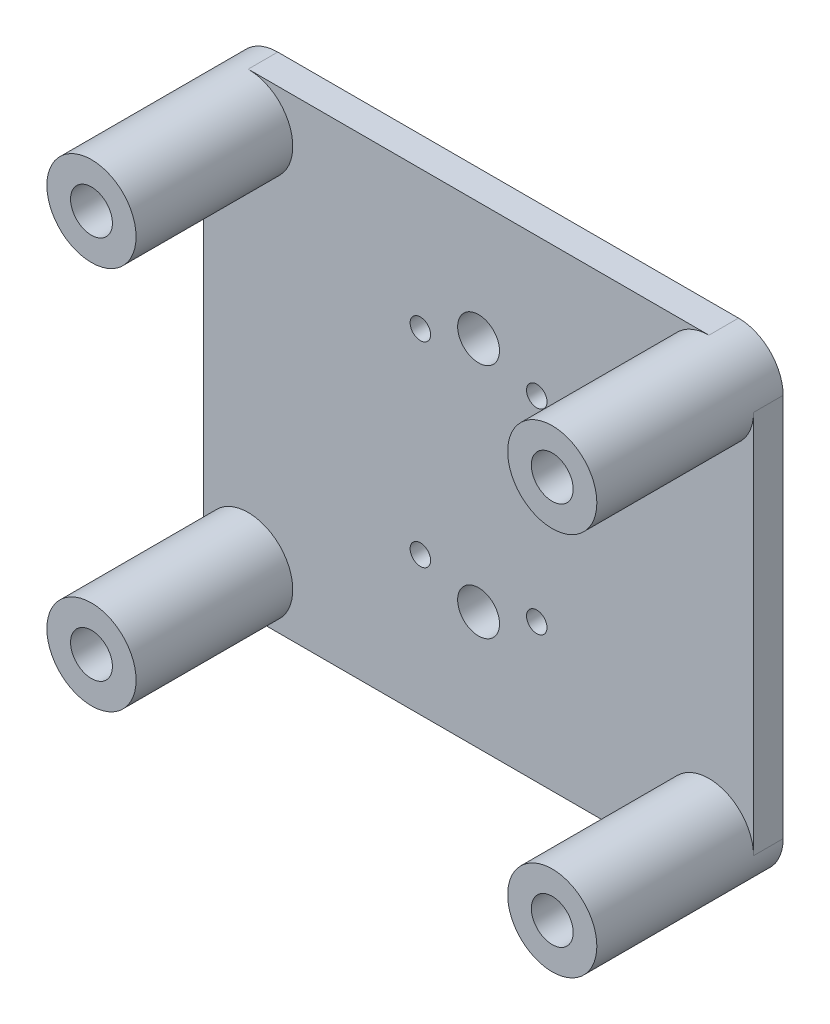
ISO-10303-21;
HEADER;
FILE_DESCRIPTION(('STEP AP214'),'2;1');
FILE_NAME('part.step','',(''),(''),'','','');
FILE_SCHEMA(('AUTOMOTIVE_DESIGN { 1 0 10303 214 1 1 1 1 }'));
ENDSEC;
DATA;
#1=APPLICATION_CONTEXT('core data for automotive mechanical design processes');
#2=APPLICATION_PROTOCOL_DEFINITION('international standard','automotive_design',2000,#1);
#3=PRODUCT_CONTEXT('',#1,'mechanical');
#4=PRODUCT('Part','Part','',(#3));
#5=PRODUCT_RELATED_PRODUCT_CATEGORY('part','',(#4));
#6=PRODUCT_DEFINITION_FORMATION('','',#4);
#7=PRODUCT_DEFINITION_CONTEXT('part definition',#1,'design');
#8=PRODUCT_DEFINITION('design','',#6,#7);
#9=PRODUCT_DEFINITION_SHAPE('','',#8);
#10=(LENGTH_UNIT() NAMED_UNIT(*) SI_UNIT(.MILLI.,.METRE.));
#11=(NAMED_UNIT(*) PLANE_ANGLE_UNIT() SI_UNIT($,.RADIAN.));
#12=(NAMED_UNIT(*) SI_UNIT($,.STERADIAN.) SOLID_ANGLE_UNIT());
#13=UNCERTAINTY_MEASURE_WITH_UNIT(LENGTH_MEASURE(1.E-05),#10,'distance_accuracy_value','');
#14=(GEOMETRIC_REPRESENTATION_CONTEXT(3) GLOBAL_UNCERTAINTY_ASSIGNED_CONTEXT((#13)) GLOBAL_UNIT_ASSIGNED_CONTEXT((#10,
#11,#12)) REPRESENTATION_CONTEXT('',''));
#15=CARTESIAN_POINT('',(0.,0.,0.));
#16=DIRECTION('',(0.,0.,1.));
#17=DIRECTION('',(1.,0.,0.));
#18=AXIS2_PLACEMENT_3D('',#15,#16,#17);
#19=CARTESIAN_POINT('',(0.,0.,3.175));
#20=DIRECTION('',(0.,0.,1.));
#21=DIRECTION('',(1.,0.,0.));
#22=AXIS2_PLACEMENT_3D('',#19,#20,#21);
#23=PLANE('',#22);
#24=CARTESIAN_POINT('',(19.1649466018959,37.6213878639813,3.175));
#25=DIRECTION('',(0.,0.,1.));
#26=DIRECTION('',(1.,0.,0.));
#27=AXIS2_PLACEMENT_3D('',#24,#25,#26);
#28=CIRCLE('',#27,1.1);
#29=CARTESIAN_POINT('',(20.2649466018959,37.6213878639813,3.175));
#30=VERTEX_POINT('',#29);
#31=EDGE_CURVE('E127',#30,#30,#28,.T.);
#32=ORIENTED_EDGE('',*,*,#31,.F.);
#33=EDGE_LOOP('',(#32));
#34=FACE_BOUND('',#33,.T.);
#35=CARTESIAN_POINT('',(6.66494660189593,37.6213878639814,3.175));
#36=DIRECTION('',(0.,0.,1.));
#37=DIRECTION('',(1.,0.,0.));
#38=AXIS2_PLACEMENT_3D('',#35,#36,#37);
#39=CIRCLE('',#38,1.1);
#40=CARTESIAN_POINT('',(7.76494660189593,37.6213878639814,3.175));
#41=VERTEX_POINT('',#40);
#42=EDGE_CURVE('E207',#41,#41,#39,.T.);
#43=ORIENTED_EDGE('',*,*,#42,.F.);
#44=EDGE_LOOP('',(#43));
#45=FACE_BOUND('',#44,.T.);
#46=CARTESIAN_POINT('',(6.66494660189591,16.6213878639814,3.175));
#47=DIRECTION('',(0.,0.,1.));
#48=DIRECTION('',(1.,0.,0.));
#49=AXIS2_PLACEMENT_3D('',#46,#47,#48);
#50=CIRCLE('',#49,1.1);
#51=CARTESIAN_POINT('',(7.76494660189591,16.6213878639814,3.175));
#52=VERTEX_POINT('',#51);
#53=EDGE_CURVE('E204',#52,#52,#50,.T.);
#54=ORIENTED_EDGE('',*,*,#53,.F.);
#55=EDGE_LOOP('',(#54));
#56=FACE_BOUND('',#55,.T.);
#57=CARTESIAN_POINT('',(19.1649466018959,16.6213878639813,3.175));
#58=DIRECTION('',(0.,0.,1.));
#59=DIRECTION('',(1.,0.,0.));
#60=AXIS2_PLACEMENT_3D('',#57,#58,#59);
#61=CIRCLE('',#60,1.1);
#62=CARTESIAN_POINT('',(20.2649466018959,16.6213878639813,3.175));
#63=VERTEX_POINT('',#62);
#64=EDGE_CURVE('E201',#63,#63,#61,.T.);
#65=ORIENTED_EDGE('',*,*,#64,.F.);
#66=EDGE_LOOP('',(#65));
#67=FACE_BOUND('',#66,.T.);
#68=CARTESIAN_POINT('',(12.9149466018959,14.4213878639813,3.175));
#69=DIRECTION('',(0.,0.,1.));
#70=DIRECTION('',(1.,0.,0.));
#71=AXIS2_PLACEMENT_3D('',#68,#69,#70);
#72=CIRCLE('',#71,2.2479);
#73=CARTESIAN_POINT('',(15.1628466018959,14.4213878639813,3.175));
#74=VERTEX_POINT('',#73);
#75=EDGE_CURVE('E198',#74,#74,#72,.T.);
#76=ORIENTED_EDGE('',*,*,#75,.F.);
#77=EDGE_LOOP('',(#76));
#78=FACE_BOUND('',#77,.T.);
#79=CARTESIAN_POINT('',(12.9149466018959,39.8213878639813,3.175));
#80=DIRECTION('',(0.,0.,1.));
#81=DIRECTION('',(1.,0.,0.));
#82=AXIS2_PLACEMENT_3D('',#79,#80,#81);
#83=CIRCLE('',#82,2.2479);
#84=CARTESIAN_POINT('',(15.1628466018959,39.8213878639813,3.175));
#85=VERTEX_POINT('',#84);
#86=EDGE_CURVE('E119',#85,#85,#83,.T.);
#87=ORIENTED_EDGE('',*,*,#86,.F.);
#88=EDGE_LOOP('',(#87));
#89=FACE_BOUND('',#88,.T.);
#90=DIRECTION('',(1.,0.,0.));
#91=VECTOR('',#90,1.);
#92=CARTESIAN_POINT('',(0.,1.72138786398134,3.175));
#93=LINE('',#92,#91);
#94=CARTESIAN_POINT('',(-11.8246533981041,1.72138786398134,3.175));
#95=VERTEX_POINT('',#94);
#96=CARTESIAN_POINT('',(37.6545466018959,1.72138786398134,3.175));
#97=VERTEX_POINT('',#96);
#98=EDGE_CURVE('E115',#95,#97,#93,.T.);
#99=ORIENTED_EDGE('',*,*,#98,.T.);
#100=CARTESIAN_POINT('',(37.6545466018959,6.50928786398134,3.175));
#101=DIRECTION('',(0.,0.,1.));
#102=DIRECTION('',(1.,0.,0.));
#103=AXIS2_PLACEMENT_3D('',#100,#101,#102);
#104=CIRCLE('',#103,4.7879);
#105=CARTESIAN_POINT('',(42.4424466018959,6.50928786398134,3.175));
#106=VERTEX_POINT('',#105);
#107=EDGE_CURVE('E52',#97,#106,#104,.F.);
#108=ORIENTED_EDGE('',*,*,#107,.T.);
#109=DIRECTION('',(0.,1.,0.));
#110=VECTOR('',#109,1.);
#111=CARTESIAN_POINT('',(42.4424466018959,0.,3.175));
#112=LINE('',#111,#110);
#113=CARTESIAN_POINT('',(42.4424466018959,47.7334878639813,3.175));
#114=VERTEX_POINT('',#113);
#115=EDGE_CURVE('E94',#106,#114,#112,.T.);
#116=ORIENTED_EDGE('',*,*,#115,.T.);
#117=CARTESIAN_POINT('',(37.6545466018959,47.7334878639813,3.175));
#118=DIRECTION('',(0.,0.,1.));
#119=DIRECTION('',(1.,0.,0.));
#120=AXIS2_PLACEMENT_3D('',#117,#118,#119);
#121=CIRCLE('',#120,4.7879);
#122=CARTESIAN_POINT('',(37.6545466018959,52.5213878639813,3.175));
#123=VERTEX_POINT('',#122);
#124=EDGE_CURVE('E243',#114,#123,#121,.F.);
#125=ORIENTED_EDGE('',*,*,#124,.T.);
#126=DIRECTION('',(1.,0.,0.));
#127=VECTOR('',#126,1.);
#128=CARTESIAN_POINT('',(0.,52.5213878639813,3.175));
#129=LINE('',#128,#127);
#130=CARTESIAN_POINT('',(-11.8246533981041,52.5213878639813,3.175));
#131=VERTEX_POINT('',#130);
#132=EDGE_CURVE('E144',#131,#123,#129,.T.);
#133=ORIENTED_EDGE('',*,*,#132,.F.);
#134=CARTESIAN_POINT('',(-11.8246533981041,47.7334878639813,3.175));
#135=DIRECTION('',(0.,0.,1.));
#136=DIRECTION('',(1.,0.,0.));
#137=AXIS2_PLACEMENT_3D('',#134,#135,#136);
#138=CIRCLE('',#137,4.7879);
#139=CARTESIAN_POINT('',(-16.6125533981041,47.7334878639813,3.175));
#140=VERTEX_POINT('',#139);
#141=EDGE_CURVE('E255',#131,#140,#138,.F.);
#142=ORIENTED_EDGE('',*,*,#141,.T.);
#143=DIRECTION('',(0.,1.,0.));
#144=VECTOR('',#143,1.);
#145=CARTESIAN_POINT('',(-16.6125533981041,0.,3.175));
#146=LINE('',#145,#144);
#147=CARTESIAN_POINT('',(-16.6125533981041,6.50928786398134,3.175));
#148=VERTEX_POINT('',#147);
#149=EDGE_CURVE('E120',#148,#140,#146,.T.);
#150=ORIENTED_EDGE('',*,*,#149,.F.);
#151=CARTESIAN_POINT('',(-11.8246533981041,6.50928786398134,3.175));
#152=DIRECTION('',(0.,0.,1.));
#153=DIRECTION('',(1.,0.,0.));
#154=AXIS2_PLACEMENT_3D('',#151,#152,#153);
#155=CIRCLE('',#154,4.7879);
#156=EDGE_CURVE('E117',#148,#95,#155,.F.);
#157=ORIENTED_EDGE('',*,*,#156,.T.);
#158=EDGE_LOOP('',(#99,#108,#116,#125,#133,#142,#150,#157));
#159=FACE_BOUND('',#158,.T.);
#160=ADVANCED_FACE('F35',(#34,#45,#56,#67,#78,#89,#159),#23,.T.);
#161=CARTESIAN_POINT('',(42.4424466018959,0.,3.175));
#162=DIRECTION('',(-1.,0.,0.));
#163=DIRECTION('',(0.,0.,1.));
#164=AXIS2_PLACEMENT_3D('',#161,#162,#163);
#165=PLANE('',#164);
#166=DIRECTION('',(0.,1.,0.));
#167=VECTOR('',#166,1.);
#168=CARTESIAN_POINT('',(42.4424466018959,0.,0.));
#169=LINE('',#168,#167);
#170=CARTESIAN_POINT('',(42.4424466018959,6.50928786398134,0.));
#171=VERTEX_POINT('',#170);
#172=CARTESIAN_POINT('',(42.4424466018959,47.7334878639813,0.));
#173=VERTEX_POINT('',#172);
#174=EDGE_CURVE('E153',#171,#173,#169,.T.);
#175=ORIENTED_EDGE('',*,*,#174,.T.);
#176=DIRECTION('',(0.,0.,-1.));
#177=VECTOR('',#176,1.);
#178=CARTESIAN_POINT('',(42.4424466018959,47.7334878639813,3.175));
#179=LINE('',#178,#177);
#180=EDGE_CURVE('E11',#114,#173,#179,.T.);
#181=ORIENTED_EDGE('',*,*,#180,.F.);
#182=ORIENTED_EDGE('',*,*,#115,.F.);
#183=DIRECTION('',(0.,0.,-1.));
#184=VECTOR('',#183,1.);
#185=CARTESIAN_POINT('',(42.4424466018959,6.50928786398134,3.175));
#186=LINE('',#185,#184);
#187=EDGE_CURVE('E110',#106,#171,#186,.T.);
#188=ORIENTED_EDGE('',*,*,#187,.T.);
#189=EDGE_LOOP('',(#175,#181,#182,#188));
#190=FACE_BOUND('',#189,.T.);
#191=ADVANCED_FACE('F37',(#190),#165,.F.);
#192=CARTESIAN_POINT('',(37.6545466018959,47.7334878639813,3.175));
#193=DIRECTION('',(0.,0.,-1.));
#194=DIRECTION('',(-1.,0.,0.));
#195=AXIS2_PLACEMENT_3D('',#192,#193,#194);
#196=CYLINDRICAL_SURFACE('',#195,4.7879);
#197=CARTESIAN_POINT('',(37.6545466018959,47.7334878639813,0.));
#198=DIRECTION('',(0.,0.,1.));
#199=DIRECTION('',(1.,0.,0.));
#200=AXIS2_PLACEMENT_3D('',#197,#198,#199);
#201=CIRCLE('',#200,4.7879);
#202=CARTESIAN_POINT('',(37.6545466018959,52.5213878639813,0.));
#203=VERTEX_POINT('',#202);
#204=EDGE_CURVE('E147',#173,#203,#201,.T.);
#205=ORIENTED_EDGE('',*,*,#204,.T.);
#206=DIRECTION('',(0.,0.,-1.));
#207=VECTOR('',#206,1.);
#208=CARTESIAN_POINT('',(37.6545466018959,52.5213878639813,3.175));
#209=LINE('',#208,#207);
#210=EDGE_CURVE('E44',#123,#203,#209,.T.);
#211=ORIENTED_EDGE('',*,*,#210,.F.);
#212=ORIENTED_EDGE('',*,*,#124,.F.);
#213=ORIENTED_EDGE('',*,*,#180,.T.);
#214=EDGE_LOOP('',(#205,#211,#212,#213));
#215=FACE_BOUND('',#214,.T.);
#216=CARTESIAN_POINT('',(37.6545466018959,47.7334878639813,20.0025));
#217=DIRECTION('',(0.,0.,1.));
#218=DIRECTION('',(1.,0.,0.));
#219=AXIS2_PLACEMENT_3D('',#216,#217,#218);
#220=CIRCLE('',#219,4.7879);
#221=CARTESIAN_POINT('',(42.4424466018959,47.7334878639813,20.0025));
#222=VERTEX_POINT('',#221);
#223=EDGE_CURVE('E249',#222,#222,#220,.T.);
#224=ORIENTED_EDGE('',*,*,#223,.F.);
#225=EDGE_LOOP('',(#224));
#226=FACE_BOUND('',#225,.T.);
#227=ADVANCED_FACE('F148',(#215,#226),#196,.T.);
#228=CARTESIAN_POINT('',(0.,52.5213878639813,3.175));
#229=DIRECTION('',(0.,1.,0.));
#230=DIRECTION('',(0.,0.,1.));
#231=AXIS2_PLACEMENT_3D('',#228,#229,#230);
#232=PLANE('',#231);
#233=DIRECTION('',(1.,0.,0.));
#234=VECTOR('',#233,1.);
#235=CARTESIAN_POINT('',(0.,52.5213878639813,0.));
#236=LINE('',#235,#234);
#237=CARTESIAN_POINT('',(-11.8246533981041,52.5213878639813,0.));
#238=VERTEX_POINT('',#237);
#239=EDGE_CURVE('E142',#238,#203,#236,.T.);
#240=ORIENTED_EDGE('',*,*,#239,.F.);
#241=DIRECTION('',(0.,0.,-1.));
#242=VECTOR('',#241,1.);
#243=CARTESIAN_POINT('',(-11.8246533981041,52.5213878639813,3.175));
#244=LINE('',#243,#242);
#245=EDGE_CURVE('E134',#131,#238,#244,.T.);
#246=ORIENTED_EDGE('',*,*,#245,.F.);
#247=ORIENTED_EDGE('',*,*,#132,.T.);
#248=ORIENTED_EDGE('',*,*,#210,.T.);
#249=EDGE_LOOP('',(#240,#246,#247,#248));
#250=FACE_BOUND('',#249,.T.);
#251=ADVANCED_FACE('F139',(#250),#232,.T.);
#252=CARTESIAN_POINT('',(-11.8246533981041,47.7334878639813,3.175));
#253=DIRECTION('',(0.,0.,-1.));
#254=DIRECTION('',(-1.,0.,0.));
#255=AXIS2_PLACEMENT_3D('',#252,#253,#254);
#256=CYLINDRICAL_SURFACE('',#255,4.7879);
#257=CARTESIAN_POINT('',(-11.8246533981041,47.7334878639813,0.));
#258=DIRECTION('',(0.,0.,1.));
#259=DIRECTION('',(1.,0.,0.));
#260=AXIS2_PLACEMENT_3D('',#257,#258,#259);
#261=CIRCLE('',#260,4.7879);
#262=CARTESIAN_POINT('',(-16.6125533981041,47.7334878639813,0.));
#263=VERTEX_POINT('',#262);
#264=EDGE_CURVE('E160',#238,#263,#261,.T.);
#265=ORIENTED_EDGE('',*,*,#264,.T.);
#266=DIRECTION('',(0.,0.,-1.));
#267=VECTOR('',#266,1.);
#268=CARTESIAN_POINT('',(-16.6125533981041,47.7334878639813,3.175));
#269=LINE('',#268,#267);
#270=EDGE_CURVE('E132',#140,#263,#269,.T.);
#271=ORIENTED_EDGE('',*,*,#270,.F.);
#272=ORIENTED_EDGE('',*,*,#141,.F.);
#273=ORIENTED_EDGE('',*,*,#245,.T.);
#274=EDGE_LOOP('',(#265,#271,#272,#273));
#275=FACE_BOUND('',#274,.T.);
#276=CARTESIAN_POINT('',(-11.8246533981041,47.7334878639813,20.0025));
#277=DIRECTION('',(0.,0.,1.));
#278=DIRECTION('',(1.,0.,0.));
#279=AXIS2_PLACEMENT_3D('',#276,#277,#278);
#280=CIRCLE('',#279,4.7879);
#281=CARTESIAN_POINT('',(-7.0367533981041,47.7334878639813,20.0025));
#282=VERTEX_POINT('',#281);
#283=EDGE_CURVE('E257',#282,#282,#280,.T.);
#284=ORIENTED_EDGE('',*,*,#283,.F.);
#285=EDGE_LOOP('',(#284));
#286=FACE_BOUND('',#285,.T.);
#287=ADVANCED_FACE('F381',(#275,#286),#256,.T.);
#288=CARTESIAN_POINT('',(-16.6125533981041,0.,3.175));
#289=DIRECTION('',(-1.,0.,0.));
#290=DIRECTION('',(0.,0.,1.));
#291=AXIS2_PLACEMENT_3D('',#288,#289,#290);
#292=PLANE('',#291);
#293=DIRECTION('',(0.,1.,0.));
#294=VECTOR('',#293,1.);
#295=CARTESIAN_POINT('',(-16.6125533981041,0.,0.));
#296=LINE('',#295,#294);
#297=CARTESIAN_POINT('',(-16.6125533981041,6.50928786398134,0.));
#298=VERTEX_POINT('',#297);
#299=EDGE_CURVE('E162',#298,#263,#296,.T.);
#300=ORIENTED_EDGE('',*,*,#299,.F.);
#301=DIRECTION('',(0.,0.,-1.));
#302=VECTOR('',#301,1.);
#303=CARTESIAN_POINT('',(-16.6125533981041,6.50928786398134,3.175));
#304=LINE('',#303,#302);
#305=EDGE_CURVE('E125',#148,#298,#304,.T.);
#306=ORIENTED_EDGE('',*,*,#305,.F.);
#307=ORIENTED_EDGE('',*,*,#149,.T.);
#308=ORIENTED_EDGE('',*,*,#270,.T.);
#309=EDGE_LOOP('',(#300,#306,#307,#308));
#310=FACE_BOUND('',#309,.T.);
#311=ADVANCED_FACE('F374',(#310),#292,.T.);
#312=CARTESIAN_POINT('',(-11.8246533981041,6.50928786398134,3.175));
#313=DIRECTION('',(0.,0.,-1.));
#314=DIRECTION('',(-1.,0.,0.));
#315=AXIS2_PLACEMENT_3D('',#312,#313,#314);
#316=CYLINDRICAL_SURFACE('',#315,4.7879);
#317=CARTESIAN_POINT('',(-11.8246533981041,6.50928786398134,0.));
#318=DIRECTION('',(0.,0.,1.));
#319=DIRECTION('',(1.,0.,0.));
#320=AXIS2_PLACEMENT_3D('',#317,#318,#319);
#321=CIRCLE('',#320,4.7879);
#322=CARTESIAN_POINT('',(-11.8246533981041,1.72138786398134,0.));
#323=VERTEX_POINT('',#322);
#324=EDGE_CURVE('E167',#298,#323,#321,.T.);
#325=ORIENTED_EDGE('',*,*,#324,.T.);
#326=DIRECTION('',(0.,0.,-1.));
#327=VECTOR('',#326,1.);
#328=CARTESIAN_POINT('',(-11.8246533981041,1.72138786398134,3.175));
#329=LINE('',#328,#327);
#330=EDGE_CURVE('E123',#95,#323,#329,.T.);
#331=ORIENTED_EDGE('',*,*,#330,.F.);
#332=ORIENTED_EDGE('',*,*,#156,.F.);
#333=ORIENTED_EDGE('',*,*,#305,.T.);
#334=EDGE_LOOP('',(#325,#331,#332,#333));
#335=FACE_BOUND('',#334,.T.);
#336=CARTESIAN_POINT('',(-11.8246533981041,6.50928786398134,20.0025));
#337=DIRECTION('',(0.,0.,1.));
#338=DIRECTION('',(1.,0.,0.));
#339=AXIS2_PLACEMENT_3D('',#336,#337,#338);
#340=CIRCLE('',#339,4.7879);
#341=CARTESIAN_POINT('',(-7.0367533981041,6.50928786398134,20.0025));
#342=VERTEX_POINT('',#341);
#343=EDGE_CURVE('E264',#342,#342,#340,.T.);
#344=ORIENTED_EDGE('',*,*,#343,.F.);
#345=EDGE_LOOP('',(#344));
#346=FACE_BOUND('',#345,.T.);
#347=ADVANCED_FACE('F372',(#335,#346),#316,.T.);
#348=CARTESIAN_POINT('',(0.,1.72138786398134,3.175));
#349=DIRECTION('',(0.,1.,0.));
#350=DIRECTION('',(-1.,0.,0.));
#351=AXIS2_PLACEMENT_3D('',#348,#349,#350);
#352=PLANE('',#351);
#353=DIRECTION('',(1.,0.,0.));
#354=VECTOR('',#353,1.);
#355=CARTESIAN_POINT('',(0.,1.72138786398134,0.));
#356=LINE('',#355,#354);
#357=CARTESIAN_POINT('',(37.6545466018959,1.72138786398134,0.));
#358=VERTEX_POINT('',#357);
#359=EDGE_CURVE('E83',#323,#358,#356,.T.);
#360=ORIENTED_EDGE('',*,*,#359,.T.);
#361=DIRECTION('',(0.,0.,-1.));
#362=VECTOR('',#361,1.);
#363=CARTESIAN_POINT('',(37.6545466018959,1.72138786398134,3.175));
#364=LINE('',#363,#362);
#365=EDGE_CURVE('E109',#97,#358,#364,.T.);
#366=ORIENTED_EDGE('',*,*,#365,.F.);
#367=ORIENTED_EDGE('',*,*,#98,.F.);
#368=ORIENTED_EDGE('',*,*,#330,.T.);
#369=EDGE_LOOP('',(#360,#366,#367,#368));
#370=FACE_BOUND('',#369,.T.);
#371=ADVANCED_FACE('F122',(#370),#352,.F.);
#372=CARTESIAN_POINT('',(-11.8246533981041,47.7334878639813,3.175));
#373=DIRECTION('',(0.,0.,-1.));
#374=DIRECTION('',(-1.,0.,0.));
#375=AXIS2_PLACEMENT_3D('',#372,#373,#374);
#376=CYLINDRICAL_SURFACE('',#375,2.2479);
#377=CARTESIAN_POINT('',(-11.8246533981041,47.7334878639813,0.));
#378=DIRECTION('',(0.,0.,1.));
#379=DIRECTION('',(1.,0.,0.));
#380=AXIS2_PLACEMENT_3D('',#377,#378,#379);
#381=CIRCLE('',#380,2.2479);
#382=CARTESIAN_POINT('',(-9.5767533981041,47.7334878639813,0.));
#383=VERTEX_POINT('',#382);
#384=EDGE_CURVE('E183',#383,#383,#381,.T.);
#385=ORIENTED_EDGE('',*,*,#384,.F.);
#386=EDGE_LOOP('',(#385));
#387=FACE_BOUND('',#386,.T.);
#388=CARTESIAN_POINT('',(-11.8246533981041,47.7334878639813,20.0025));
#389=DIRECTION('',(0.,0.,1.));
#390=DIRECTION('',(1.,0.,0.));
#391=AXIS2_PLACEMENT_3D('',#388,#389,#390);
#392=CIRCLE('',#391,2.2479);
#393=CARTESIAN_POINT('',(-9.5767533981041,47.7334878639813,20.0025));
#394=VERTEX_POINT('',#393);
#395=EDGE_CURVE('E260',#394,#394,#392,.T.);
#396=ORIENTED_EDGE('',*,*,#395,.T.);
#397=EDGE_LOOP('',(#396));
#398=FACE_BOUND('',#397,.T.);
#399=ADVANCED_FACE('F311',(#387,#398),#376,.F.);
#400=CARTESIAN_POINT('',(-11.8246533981041,6.50928786398134,3.175));
#401=DIRECTION('',(0.,0.,-1.));
#402=DIRECTION('',(-1.,0.,0.));
#403=AXIS2_PLACEMENT_3D('',#400,#401,#402);
#404=CYLINDRICAL_SURFACE('',#403,2.2479);
#405=CARTESIAN_POINT('',(-11.8246533981041,6.50928786398134,0.));
#406=DIRECTION('',(0.,0.,1.));
#407=DIRECTION('',(1.,0.,0.));
#408=AXIS2_PLACEMENT_3D('',#405,#406,#407);
#409=CIRCLE('',#408,2.2479);
#410=CARTESIAN_POINT('',(-9.5767533981041,6.50928786398134,0.));
#411=VERTEX_POINT('',#410);
#412=EDGE_CURVE('E180',#411,#411,#409,.T.);
#413=ORIENTED_EDGE('',*,*,#412,.F.);
#414=EDGE_LOOP('',(#413));
#415=FACE_BOUND('',#414,.T.);
#416=CARTESIAN_POINT('',(-11.8246533981041,6.50928786398134,20.0025));
#417=DIRECTION('',(0.,0.,1.));
#418=DIRECTION('',(1.,0.,0.));
#419=AXIS2_PLACEMENT_3D('',#416,#417,#418);
#420=CIRCLE('',#419,2.2479);
#421=CARTESIAN_POINT('',(-9.5767533981041,6.50928786398134,20.0025));
#422=VERTEX_POINT('',#421);
#423=EDGE_CURVE('E111',#422,#422,#420,.T.);
#424=ORIENTED_EDGE('',*,*,#423,.T.);
#425=EDGE_LOOP('',(#424));
#426=FACE_BOUND('',#425,.T.);
#427=ADVANCED_FACE('F314',(#415,#426),#404,.F.);
#428=CARTESIAN_POINT('',(37.6545466018959,6.50928786398134,3.175));
#429=DIRECTION('',(0.,0.,-1.));
#430=DIRECTION('',(-1.,0.,0.));
#431=AXIS2_PLACEMENT_3D('',#428,#429,#430);
#432=CYLINDRICAL_SURFACE('',#431,2.2479);
#433=CARTESIAN_POINT('',(37.6545466018959,6.50928786398134,0.));
#434=DIRECTION('',(0.,0.,1.));
#435=DIRECTION('',(1.,0.,0.));
#436=AXIS2_PLACEMENT_3D('',#433,#434,#435);
#437=CIRCLE('',#436,2.2479);
#438=CARTESIAN_POINT('',(39.9024466018959,6.50928786398134,0.));
#439=VERTEX_POINT('',#438);
#440=EDGE_CURVE('E177',#439,#439,#437,.T.);
#441=ORIENTED_EDGE('',*,*,#440,.F.);
#442=EDGE_LOOP('',(#441));
#443=FACE_BOUND('',#442,.T.);
#444=CARTESIAN_POINT('',(37.6545466018959,6.50928786398134,20.0025));
#445=DIRECTION('',(0.,0.,1.));
#446=DIRECTION('',(1.,0.,0.));
#447=AXIS2_PLACEMENT_3D('',#444,#445,#446);
#448=CIRCLE('',#447,2.2479);
#449=CARTESIAN_POINT('',(39.9024466018959,6.50928786398134,20.0025));
#450=VERTEX_POINT('',#449);
#451=EDGE_CURVE('E271',#450,#450,#448,.T.);
#452=ORIENTED_EDGE('',*,*,#451,.T.);
#453=EDGE_LOOP('',(#452));
#454=FACE_BOUND('',#453,.T.);
#455=ADVANCED_FACE('F275',(#443,#454),#432,.F.);
#456=CARTESIAN_POINT('',(19.1649466018959,37.6213878639813,3.175));
#457=DIRECTION('',(0.,0.,-1.));
#458=DIRECTION('',(-1.,0.,0.));
#459=AXIS2_PLACEMENT_3D('',#456,#457,#458);
#460=CYLINDRICAL_SURFACE('',#459,1.1);
#461=ORIENTED_EDGE('',*,*,#31,.T.);
#462=EDGE_LOOP('',(#461));
#463=FACE_BOUND('',#462,.T.);
#464=CARTESIAN_POINT('',(19.1649466018959,37.6213878639813,-5.08));
#465=DIRECTION('',(0.,0.,1.));
#466=DIRECTION('',(1.,0.,0.));
#467=AXIS2_PLACEMENT_3D('',#464,#465,#466);
#468=CIRCLE('',#467,1.1);
#469=CARTESIAN_POINT('',(20.2649466018959,37.6213878639813,-5.08));
#470=VERTEX_POINT('',#469);
#471=EDGE_CURVE('E214',#470,#470,#468,.T.);
#472=ORIENTED_EDGE('',*,*,#471,.F.);
#473=EDGE_LOOP('',(#472));
#474=FACE_BOUND('',#473,.T.);
#475=ADVANCED_FACE('F321',(#463,#474),#460,.F.);
#476=CARTESIAN_POINT('',(6.66494660189593,37.6213878639814,3.175));
#477=DIRECTION('',(0.,0.,-1.));
#478=DIRECTION('',(-1.,0.,0.));
#479=AXIS2_PLACEMENT_3D('',#476,#477,#478);
#480=CYLINDRICAL_SURFACE('',#479,1.1);
#481=ORIENTED_EDGE('',*,*,#42,.T.);
#482=EDGE_LOOP('',(#481));
#483=FACE_BOUND('',#482,.T.);
#484=CARTESIAN_POINT('',(6.66494660189593,37.6213878639814,-5.08));
#485=DIRECTION('',(0.,0.,1.));
#486=DIRECTION('',(1.,0.,0.));
#487=AXIS2_PLACEMENT_3D('',#484,#485,#486);
#488=CIRCLE('',#487,1.1);
#489=CARTESIAN_POINT('',(7.76494660189593,37.6213878639814,-5.08));
#490=VERTEX_POINT('',#489);
#491=EDGE_CURVE('E223',#490,#490,#488,.T.);
#492=ORIENTED_EDGE('',*,*,#491,.F.);
#493=EDGE_LOOP('',(#492));
#494=FACE_BOUND('',#493,.T.);
#495=ADVANCED_FACE('F325',(#483,#494),#480,.F.);
#496=CARTESIAN_POINT('',(6.66494660189591,16.6213878639814,3.175));
#497=DIRECTION('',(0.,0.,-1.));
#498=DIRECTION('',(-1.,0.,0.));
#499=AXIS2_PLACEMENT_3D('',#496,#497,#498);
#500=CYLINDRICAL_SURFACE('',#499,1.1);
#501=ORIENTED_EDGE('',*,*,#53,.T.);
#502=EDGE_LOOP('',(#501));
#503=FACE_BOUND('',#502,.T.);
#504=CARTESIAN_POINT('',(6.66494660189591,16.6213878639814,-5.08));
#505=DIRECTION('',(0.,0.,1.));
#506=DIRECTION('',(1.,0.,0.));
#507=AXIS2_PLACEMENT_3D('',#504,#505,#506);
#508=CIRCLE('',#507,1.1);
#509=CARTESIAN_POINT('',(7.76494660189591,16.6213878639814,-5.08));
#510=VERTEX_POINT('',#509);
#511=EDGE_CURVE('E233',#510,#510,#508,.T.);
#512=ORIENTED_EDGE('',*,*,#511,.F.);
#513=EDGE_LOOP('',(#512));
#514=FACE_BOUND('',#513,.T.);
#515=ADVANCED_FACE('F329',(#503,#514),#500,.F.);
#516=CARTESIAN_POINT('',(19.1649466018959,16.6213878639813,3.175));
#517=DIRECTION('',(0.,0.,-1.));
#518=DIRECTION('',(-1.,0.,0.));
#519=AXIS2_PLACEMENT_3D('',#516,#517,#518);
#520=CYLINDRICAL_SURFACE('',#519,1.1);
#521=ORIENTED_EDGE('',*,*,#64,.T.);
#522=EDGE_LOOP('',(#521));
#523=FACE_BOUND('',#522,.T.);
#524=CARTESIAN_POINT('',(19.1649466018959,16.6213878639813,-5.08));
#525=DIRECTION('',(0.,0.,1.));
#526=DIRECTION('',(1.,0.,0.));
#527=AXIS2_PLACEMENT_3D('',#524,#525,#526);
#528=CIRCLE('',#527,1.1);
#529=CARTESIAN_POINT('',(20.2649466018959,16.6213878639813,-5.08));
#530=VERTEX_POINT('',#529);
#531=EDGE_CURVE('E242',#530,#530,#528,.T.);
#532=ORIENTED_EDGE('',*,*,#531,.F.);
#533=EDGE_LOOP('',(#532));
#534=FACE_BOUND('',#533,.T.);
#535=ADVANCED_FACE('F333',(#523,#534),#520,.F.);
#536=CARTESIAN_POINT('',(12.9149466018959,14.4213878639813,3.175));
#537=DIRECTION('',(0.,0.,-1.));
#538=DIRECTION('',(-1.,0.,0.));
#539=AXIS2_PLACEMENT_3D('',#536,#537,#538);
#540=CYLINDRICAL_SURFACE('',#539,2.2479);
#541=ORIENTED_EDGE('',*,*,#75,.T.);
#542=EDGE_LOOP('',(#541));
#543=FACE_BOUND('',#542,.T.);
#544=CARTESIAN_POINT('',(12.9149466018959,14.4213878639813,0.));
#545=DIRECTION('',(0.,0.,1.));
#546=DIRECTION('',(1.,0.,0.));
#547=AXIS2_PLACEMENT_3D('',#544,#545,#546);
#548=CIRCLE('',#547,2.2479);
#549=CARTESIAN_POINT('',(15.1628466018959,14.4213878639813,0.));
#550=VERTEX_POINT('',#549);
#551=EDGE_CURVE('E174',#550,#550,#548,.T.);
#552=ORIENTED_EDGE('',*,*,#551,.F.);
#553=EDGE_LOOP('',(#552));
#554=FACE_BOUND('',#553,.T.);
#555=ADVANCED_FACE('F293',(#543,#554),#540,.F.);
#556=CARTESIAN_POINT('',(12.9149466018959,39.8213878639813,3.175));
#557=DIRECTION('',(0.,0.,-1.));
#558=DIRECTION('',(-1.,0.,0.));
#559=AXIS2_PLACEMENT_3D('',#556,#557,#558);
#560=CYLINDRICAL_SURFACE('',#559,2.2479);
#561=ORIENTED_EDGE('',*,*,#86,.T.);
#562=EDGE_LOOP('',(#561));
#563=FACE_BOUND('',#562,.T.);
#564=CARTESIAN_POINT('',(12.9149466018959,39.8213878639813,0.));
#565=DIRECTION('',(0.,0.,1.));
#566=DIRECTION('',(1.,0.,0.));
#567=AXIS2_PLACEMENT_3D('',#564,#565,#566);
#568=CIRCLE('',#567,2.2479);
#569=CARTESIAN_POINT('',(15.1628466018959,39.8213878639813,0.));
#570=VERTEX_POINT('',#569);
#571=EDGE_CURVE('E171',#570,#570,#568,.T.);
#572=ORIENTED_EDGE('',*,*,#571,.F.);
#573=EDGE_LOOP('',(#572));
#574=FACE_BOUND('',#573,.T.);
#575=ADVANCED_FACE('F285',(#563,#574),#560,.F.);
#576=CARTESIAN_POINT('',(37.6545466018959,6.50928786398134,3.175));
#577=DIRECTION('',(0.,0.,-1.));
#578=DIRECTION('',(-1.,0.,0.));
#579=AXIS2_PLACEMENT_3D('',#576,#577,#578);
#580=CYLINDRICAL_SURFACE('',#579,4.7879);
#581=CARTESIAN_POINT('',(37.6545466018959,6.50928786398134,0.));
#582=DIRECTION('',(0.,0.,1.));
#583=DIRECTION('',(1.,0.,0.));
#584=AXIS2_PLACEMENT_3D('',#581,#582,#583);
#585=CIRCLE('',#584,4.7879);
#586=EDGE_CURVE('E89',#358,#171,#585,.T.);
#587=ORIENTED_EDGE('',*,*,#586,.T.);
#588=ORIENTED_EDGE('',*,*,#187,.F.);
#589=ORIENTED_EDGE('',*,*,#107,.F.);
#590=ORIENTED_EDGE('',*,*,#365,.T.);
#591=EDGE_LOOP('',(#587,#588,#589,#590));
#592=FACE_BOUND('',#591,.T.);
#593=CARTESIAN_POINT('',(37.6545466018959,6.50928786398134,20.0025));
#594=DIRECTION('',(0.,0.,1.));
#595=DIRECTION('',(1.,0.,0.));
#596=AXIS2_PLACEMENT_3D('',#593,#594,#595);
#597=CIRCLE('',#596,4.7879);
#598=CARTESIAN_POINT('',(42.4424466018959,6.50928786398134,20.0025));
#599=VERTEX_POINT('',#598);
#600=EDGE_CURVE('E112',#599,#599,#597,.T.);
#601=ORIENTED_EDGE('',*,*,#600,.F.);
#602=EDGE_LOOP('',(#601));
#603=FACE_BOUND('',#602,.T.);
#604=ADVANCED_FACE('F107',(#592,#603),#580,.T.);
#605=CARTESIAN_POINT('',(37.6545466018959,47.7334878639813,3.175));
#606=DIRECTION('',(0.,0.,-1.));
#607=DIRECTION('',(-1.,0.,0.));
#608=AXIS2_PLACEMENT_3D('',#605,#606,#607);
#609=CYLINDRICAL_SURFACE('',#608,2.2479);
#610=CARTESIAN_POINT('',(37.6545466018959,47.7334878639813,0.));
#611=DIRECTION('',(0.,0.,1.));
#612=DIRECTION('',(1.,0.,0.));
#613=AXIS2_PLACEMENT_3D('',#610,#611,#612);
#614=CIRCLE('',#613,2.2479);
#615=CARTESIAN_POINT('',(39.9024466018959,47.7334878639813,0.));
#616=VERTEX_POINT('',#615);
#617=EDGE_CURVE('E185',#616,#616,#614,.T.);
#618=ORIENTED_EDGE('',*,*,#617,.F.);
#619=EDGE_LOOP('',(#618));
#620=FACE_BOUND('',#619,.T.);
#621=CARTESIAN_POINT('',(37.6545466018959,47.7334878639813,20.0025));
#622=DIRECTION('',(0.,0.,1.));
#623=DIRECTION('',(1.,0.,0.));
#624=AXIS2_PLACEMENT_3D('',#621,#622,#623);
#625=CIRCLE('',#624,2.2479);
#626=CARTESIAN_POINT('',(39.9024466018959,47.7334878639813,20.0025));
#627=VERTEX_POINT('',#626);
#628=EDGE_CURVE('E252',#627,#627,#625,.T.);
#629=ORIENTED_EDGE('',*,*,#628,.T.);
#630=EDGE_LOOP('',(#629));
#631=FACE_BOUND('',#630,.T.);
#632=ADVANCED_FACE('F284',(#620,#631),#609,.F.);
#633=CARTESIAN_POINT('',(0.,0.,0.));
#634=DIRECTION('',(0.,0.,1.));
#635=DIRECTION('',(1.,0.,0.));
#636=AXIS2_PLACEMENT_3D('',#633,#634,#635);
#637=PLANE('',#636);
#638=ORIENTED_EDGE('',*,*,#174,.F.);
#639=ORIENTED_EDGE('',*,*,#586,.F.);
#640=ORIENTED_EDGE('',*,*,#359,.F.);
#641=ORIENTED_EDGE('',*,*,#324,.F.);
#642=ORIENTED_EDGE('',*,*,#299,.T.);
#643=ORIENTED_EDGE('',*,*,#264,.F.);
#644=ORIENTED_EDGE('',*,*,#239,.T.);
#645=ORIENTED_EDGE('',*,*,#204,.F.);
#646=EDGE_LOOP('',(#638,#639,#640,#641,#642,#643,#644,#645));
#647=FACE_BOUND('',#646,.T.);
#648=ORIENTED_EDGE('',*,*,#617,.T.);
#649=EDGE_LOOP('',(#648));
#650=FACE_BOUND('',#649,.T.);
#651=ORIENTED_EDGE('',*,*,#551,.T.);
#652=EDGE_LOOP('',(#651));
#653=FACE_BOUND('',#652,.T.);
#654=ORIENTED_EDGE('',*,*,#571,.T.);
#655=EDGE_LOOP('',(#654));
#656=FACE_BOUND('',#655,.T.);
#657=CARTESIAN_POINT('',(19.1649466018959,37.6213878639813,0.));
#658=DIRECTION('',(0.,0.,1.));
#659=DIRECTION('',(1.,0.,0.));
#660=AXIS2_PLACEMENT_3D('',#657,#658,#659);
#661=CIRCLE('',#660,2.2);
#662=CARTESIAN_POINT('',(21.3649466018959,37.6213878639813,0.));
#663=VERTEX_POINT('',#662);
#664=EDGE_CURVE('E191',#663,#663,#661,.T.);
#665=ORIENTED_EDGE('',*,*,#664,.T.);
#666=EDGE_LOOP('',(#665));
#667=FACE_BOUND('',#666,.T.);
#668=CARTESIAN_POINT('',(6.66494660189593,37.6213878639814,0.));
#669=DIRECTION('',(0.,0.,1.));
#670=DIRECTION('',(1.,0.,0.));
#671=AXIS2_PLACEMENT_3D('',#668,#669,#670);
#672=CIRCLE('',#671,2.20000000000001);
#673=CARTESIAN_POINT('',(8.86494660189594,37.6213878639814,0.));
#674=VERTEX_POINT('',#673);
#675=EDGE_CURVE('E220',#674,#674,#672,.T.);
#676=ORIENTED_EDGE('',*,*,#675,.T.);
#677=EDGE_LOOP('',(#676));
#678=FACE_BOUND('',#677,.T.);
#679=CARTESIAN_POINT('',(6.66494660189591,16.6213878639814,0.));
#680=DIRECTION('',(0.,0.,1.));
#681=DIRECTION('',(1.,0.,0.));
#682=AXIS2_PLACEMENT_3D('',#679,#680,#681);
#683=CIRCLE('',#682,2.19999999999999);
#684=CARTESIAN_POINT('',(8.8649466018959,16.6213878639814,0.));
#685=VERTEX_POINT('',#684);
#686=EDGE_CURVE('E230',#685,#685,#683,.T.);
#687=ORIENTED_EDGE('',*,*,#686,.T.);
#688=EDGE_LOOP('',(#687));
#689=FACE_BOUND('',#688,.T.);
#690=CARTESIAN_POINT('',(19.1649466018959,16.6213878639813,0.));
#691=DIRECTION('',(0.,0.,1.));
#692=DIRECTION('',(1.,0.,0.));
#693=AXIS2_PLACEMENT_3D('',#690,#691,#692);
#694=CIRCLE('',#693,2.2);
#695=CARTESIAN_POINT('',(21.3649466018959,16.6213878639813,0.));
#696=VERTEX_POINT('',#695);
#697=EDGE_CURVE('E239',#696,#696,#694,.T.);
#698=ORIENTED_EDGE('',*,*,#697,.T.);
#699=EDGE_LOOP('',(#698));
#700=FACE_BOUND('',#699,.T.);
#701=ORIENTED_EDGE('',*,*,#384,.T.);
#702=EDGE_LOOP('',(#701));
#703=FACE_BOUND('',#702,.T.);
#704=ORIENTED_EDGE('',*,*,#412,.T.);
#705=EDGE_LOOP('',(#704));
#706=FACE_BOUND('',#705,.T.);
#707=ORIENTED_EDGE('',*,*,#440,.T.);
#708=EDGE_LOOP('',(#707));
#709=FACE_BOUND('',#708,.T.);
#710=ADVANCED_FACE('F156',(#647,#650,#653,#656,#667,#678,#689,#700,#703,#706,#709),#637,.F.);
#711=CARTESIAN_POINT('',(19.1649466018959,37.6213878639813,-5.08));
#712=DIRECTION('',(0.,0.,1.));
#713=DIRECTION('',(1.,0.,0.));
#714=AXIS2_PLACEMENT_3D('',#711,#712,#713);
#715=CYLINDRICAL_SURFACE('',#714,2.2);
#716=CARTESIAN_POINT('',(19.1649466018959,37.6213878639813,-5.08));
#717=DIRECTION('',(0.,0.,1.));
#718=DIRECTION('',(1.,0.,0.));
#719=AXIS2_PLACEMENT_3D('',#716,#717,#718);
#720=CIRCLE('',#719,2.2);
#721=CARTESIAN_POINT('',(21.3649466018959,37.6213878639813,-5.08));
#722=VERTEX_POINT('',#721);
#723=EDGE_CURVE('E211',#722,#722,#720,.T.);
#724=ORIENTED_EDGE('',*,*,#723,.T.);
#725=EDGE_LOOP('',(#724));
#726=FACE_BOUND('',#725,.T.);
#727=ORIENTED_EDGE('',*,*,#664,.F.);
#728=EDGE_LOOP('',(#727));
#729=FACE_BOUND('',#728,.T.);
#730=ADVANCED_FACE('F307',(#726,#729),#715,.T.);
#731=CARTESIAN_POINT('',(0.,0.,-5.08));
#732=DIRECTION('',(0.,0.,1.));
#733=DIRECTION('',(1.,0.,0.));
#734=AXIS2_PLACEMENT_3D('',#731,#732,#733);
#735=PLANE('',#734);
#736=ORIENTED_EDGE('',*,*,#471,.T.);
#737=EDGE_LOOP('',(#736));
#738=FACE_BOUND('',#737,.T.);
#739=ORIENTED_EDGE('',*,*,#723,.F.);
#740=EDGE_LOOP('',(#739));
#741=FACE_BOUND('',#740,.T.);
#742=ADVANCED_FACE('F520',(#738,#741),#735,.F.);
#743=CARTESIAN_POINT('',(6.66494660189593,37.6213878639814,-5.08));
#744=DIRECTION('',(0.,0.,1.));
#745=DIRECTION('',(1.,0.,0.));
#746=AXIS2_PLACEMENT_3D('',#743,#744,#745);
#747=CYLINDRICAL_SURFACE('',#746,2.20000000000001);
#748=CARTESIAN_POINT('',(6.66494660189593,37.6213878639814,-5.08));
#749=DIRECTION('',(0.,0.,1.));
#750=DIRECTION('',(1.,0.,0.));
#751=AXIS2_PLACEMENT_3D('',#748,#749,#750);
#752=CIRCLE('',#751,2.20000000000001);
#753=CARTESIAN_POINT('',(8.86494660189594,37.6213878639814,-5.08));
#754=VERTEX_POINT('',#753);
#755=EDGE_CURVE('E225',#754,#754,#752,.T.);
#756=ORIENTED_EDGE('',*,*,#755,.T.);
#757=EDGE_LOOP('',(#756));
#758=FACE_BOUND('',#757,.T.);
#759=ORIENTED_EDGE('',*,*,#675,.F.);
#760=EDGE_LOOP('',(#759));
#761=FACE_BOUND('',#760,.T.);
#762=ADVANCED_FACE('F517',(#758,#761),#747,.T.);
#763=CARTESIAN_POINT('',(0.,0.,-5.08));
#764=DIRECTION('',(0.,0.,1.));
#765=DIRECTION('',(1.,0.,0.));
#766=AXIS2_PLACEMENT_3D('',#763,#764,#765);
#767=PLANE('',#766);
#768=ORIENTED_EDGE('',*,*,#491,.T.);
#769=EDGE_LOOP('',(#768));
#770=FACE_BOUND('',#769,.T.);
#771=ORIENTED_EDGE('',*,*,#755,.F.);
#772=EDGE_LOOP('',(#771));
#773=FACE_BOUND('',#772,.T.);
#774=ADVANCED_FACE('F513',(#770,#773),#767,.F.);
#775=CARTESIAN_POINT('',(6.66494660189591,16.6213878639814,-5.08));
#776=DIRECTION('',(0.,0.,1.));
#777=DIRECTION('',(1.,0.,0.));
#778=AXIS2_PLACEMENT_3D('',#775,#776,#777);
#779=CYLINDRICAL_SURFACE('',#778,2.19999999999999);
#780=CARTESIAN_POINT('',(6.66494660189591,16.6213878639814,-5.08));
#781=DIRECTION('',(0.,0.,1.));
#782=DIRECTION('',(1.,0.,0.));
#783=AXIS2_PLACEMENT_3D('',#780,#781,#782);
#784=CIRCLE('',#783,2.19999999999999);
#785=CARTESIAN_POINT('',(8.8649466018959,16.6213878639814,-5.08));
#786=VERTEX_POINT('',#785);
#787=EDGE_CURVE('E224',#786,#786,#784,.T.);
#788=ORIENTED_EDGE('',*,*,#787,.T.);
#789=EDGE_LOOP('',(#788));
#790=FACE_BOUND('',#789,.T.);
#791=ORIENTED_EDGE('',*,*,#686,.F.);
#792=EDGE_LOOP('',(#791));
#793=FACE_BOUND('',#792,.T.);
#794=ADVANCED_FACE('F509',(#790,#793),#779,.T.);
#795=CARTESIAN_POINT('',(0.,0.,-5.08));
#796=DIRECTION('',(0.,0.,1.));
#797=DIRECTION('',(1.,0.,0.));
#798=AXIS2_PLACEMENT_3D('',#795,#796,#797);
#799=PLANE('',#798);
#800=ORIENTED_EDGE('',*,*,#511,.T.);
#801=EDGE_LOOP('',(#800));
#802=FACE_BOUND('',#801,.T.);
#803=ORIENTED_EDGE('',*,*,#787,.F.);
#804=EDGE_LOOP('',(#803));
#805=FACE_BOUND('',#804,.T.);
#806=ADVANCED_FACE('F505',(#802,#805),#799,.F.);
#807=CARTESIAN_POINT('',(19.1649466018959,16.6213878639813,-5.08));
#808=DIRECTION('',(0.,0.,1.));
#809=DIRECTION('',(1.,0.,0.));
#810=AXIS2_PLACEMENT_3D('',#807,#808,#809);
#811=CYLINDRICAL_SURFACE('',#810,2.2);
#812=CARTESIAN_POINT('',(19.1649466018959,16.6213878639813,-5.08));
#813=DIRECTION('',(0.,0.,1.));
#814=DIRECTION('',(1.,0.,0.));
#815=AXIS2_PLACEMENT_3D('',#812,#813,#814);
#816=CIRCLE('',#815,2.2);
#817=CARTESIAN_POINT('',(21.3649466018959,16.6213878639813,-5.08));
#818=VERTEX_POINT('',#817);
#819=EDGE_CURVE('E234',#818,#818,#816,.T.);
#820=ORIENTED_EDGE('',*,*,#819,.T.);
#821=EDGE_LOOP('',(#820));
#822=FACE_BOUND('',#821,.T.);
#823=ORIENTED_EDGE('',*,*,#697,.F.);
#824=EDGE_LOOP('',(#823));
#825=FACE_BOUND('',#824,.T.);
#826=ADVANCED_FACE('F501',(#822,#825),#811,.T.);
#827=CARTESIAN_POINT('',(0.,0.,-5.08));
#828=DIRECTION('',(0.,0.,1.));
#829=DIRECTION('',(1.,0.,0.));
#830=AXIS2_PLACEMENT_3D('',#827,#828,#829);
#831=PLANE('',#830);
#832=ORIENTED_EDGE('',*,*,#531,.T.);
#833=EDGE_LOOP('',(#832));
#834=FACE_BOUND('',#833,.T.);
#835=ORIENTED_EDGE('',*,*,#819,.F.);
#836=EDGE_LOOP('',(#835));
#837=FACE_BOUND('',#836,.T.);
#838=ADVANCED_FACE('F470',(#834,#837),#831,.F.);
#839=CARTESIAN_POINT('',(0.,0.,20.0025));
#840=DIRECTION('',(0.,0.,1.));
#841=DIRECTION('',(1.,0.,0.));
#842=AXIS2_PLACEMENT_3D('',#839,#840,#841);
#843=PLANE('',#842);
#844=ORIENTED_EDGE('',*,*,#628,.F.);
#845=EDGE_LOOP('',(#844));
#846=FACE_BOUND('',#845,.T.);
#847=ORIENTED_EDGE('',*,*,#223,.T.);
#848=EDGE_LOOP('',(#847));
#849=FACE_BOUND('',#848,.T.);
#850=ADVANCED_FACE('F466',(#846,#849),#843,.T.);
#851=CARTESIAN_POINT('',(0.,0.,20.0025));
#852=DIRECTION('',(0.,0.,1.));
#853=DIRECTION('',(1.,0.,0.));
#854=AXIS2_PLACEMENT_3D('',#851,#852,#853);
#855=PLANE('',#854);
#856=ORIENTED_EDGE('',*,*,#395,.F.);
#857=EDGE_LOOP('',(#856));
#858=FACE_BOUND('',#857,.T.);
#859=ORIENTED_EDGE('',*,*,#283,.T.);
#860=EDGE_LOOP('',(#859));
#861=FACE_BOUND('',#860,.T.);
#862=ADVANCED_FACE('F368',(#858,#861),#855,.T.);
#863=CARTESIAN_POINT('',(0.,0.,20.0025));
#864=DIRECTION('',(0.,0.,1.));
#865=DIRECTION('',(1.,0.,0.));
#866=AXIS2_PLACEMENT_3D('',#863,#864,#865);
#867=PLANE('',#866);
#868=ORIENTED_EDGE('',*,*,#423,.F.);
#869=EDGE_LOOP('',(#868));
#870=FACE_BOUND('',#869,.T.);
#871=ORIENTED_EDGE('',*,*,#343,.T.);
#872=EDGE_LOOP('',(#871));
#873=FACE_BOUND('',#872,.T.);
#874=ADVANCED_FACE('F280',(#870,#873),#867,.T.);
#875=CARTESIAN_POINT('',(0.,0.,20.0025));
#876=DIRECTION('',(0.,0.,1.));
#877=DIRECTION('',(1.,0.,0.));
#878=AXIS2_PLACEMENT_3D('',#875,#876,#877);
#879=PLANE('',#878);
#880=ORIENTED_EDGE('',*,*,#451,.F.);
#881=EDGE_LOOP('',(#880));
#882=FACE_BOUND('',#881,.T.);
#883=ORIENTED_EDGE('',*,*,#600,.T.);
#884=EDGE_LOOP('',(#883));
#885=FACE_BOUND('',#884,.T.);
#886=ADVANCED_FACE('F277',(#882,#885),#879,.T.);
#887=CLOSED_SHELL('',(#160,#191,#227,#251,#287,#311,#347,#371,#399,#427,#455,#475,#495,#515,
#535,#555,#575,#604,#632,#710,#730,#742,#762,#774,#794,#806,#826,#838,#850,#862,#874,#886));
#888=MANIFOLD_SOLID_BREP('B2',#887);
#889=ADVANCED_BREP_SHAPE_REPRESENTATION('',(#18,#888),#14);
#890=SHAPE_DEFINITION_REPRESENTATION(#9,#889);
ENDSEC;
END-ISO-10303-21;
